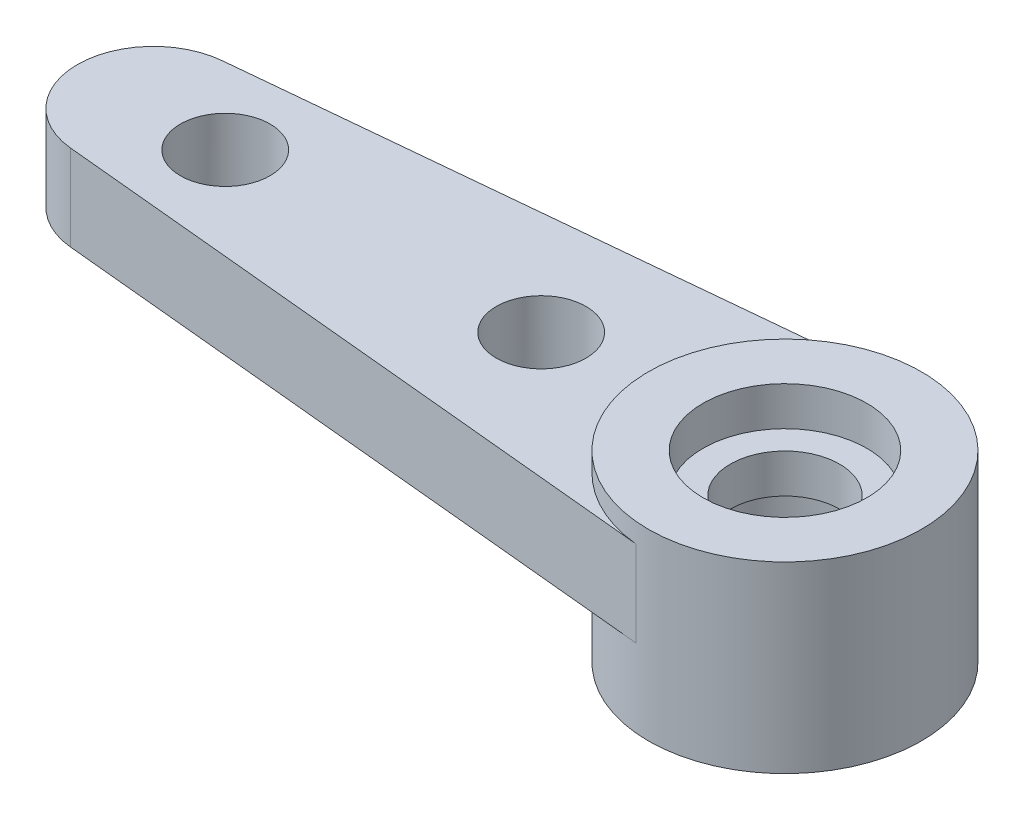
ISO-10303-21;
HEADER;
FILE_DESCRIPTION(('STEP AP214'),'2;1');
FILE_NAME('part.step','',(''),(''),'','','');
FILE_SCHEMA(('AUTOMOTIVE_DESIGN { 1 0 10303 214 1 1 1 1 }'));
ENDSEC;
DATA;
#1=APPLICATION_CONTEXT('core data for automotive mechanical design processes');
#2=APPLICATION_PROTOCOL_DEFINITION('international standard','automotive_design',2000,#1);
#3=PRODUCT_CONTEXT('',#1,'mechanical');
#4=PRODUCT('Part','Part','',(#3));
#5=PRODUCT_RELATED_PRODUCT_CATEGORY('part','',(#4));
#6=PRODUCT_DEFINITION_FORMATION('','',#4);
#7=PRODUCT_DEFINITION_CONTEXT('part definition',#1,'design');
#8=PRODUCT_DEFINITION('design','',#6,#7);
#9=PRODUCT_DEFINITION_SHAPE('','',#8);
#10=(LENGTH_UNIT() NAMED_UNIT(*) SI_UNIT(.MILLI.,.METRE.));
#11=(NAMED_UNIT(*) PLANE_ANGLE_UNIT() SI_UNIT($,.RADIAN.));
#12=(NAMED_UNIT(*) SI_UNIT($,.STERADIAN.) SOLID_ANGLE_UNIT());
#13=UNCERTAINTY_MEASURE_WITH_UNIT(LENGTH_MEASURE(1.E-05),#10,'distance_accuracy_value','');
#14=(GEOMETRIC_REPRESENTATION_CONTEXT(3) GLOBAL_UNCERTAINTY_ASSIGNED_CONTEXT((#13)) GLOBAL_UNIT_ASSIGNED_CONTEXT((#10,
#11,#12)) REPRESENTATION_CONTEXT('',''));
#15=CARTESIAN_POINT('',(0.,0.,0.));
#16=DIRECTION('',(0.,0.,1.));
#17=DIRECTION('',(1.,0.,0.));
#18=AXIS2_PLACEMENT_3D('',#15,#16,#17);
#19=CARTESIAN_POINT('',(0.,4.7,0.));
#20=DIRECTION('',(0.,-1.,0.));
#21=DIRECTION('',(0.,0.,-1.));
#22=AXIS2_PLACEMENT_3D('',#19,#20,#21);
#23=CYLINDRICAL_SURFACE('',#22,2.1);
#24=CARTESIAN_POINT('',(0.,0.,0.));
#25=DIRECTION('',(0.,1.,0.));
#26=DIRECTION('',(0.,0.,1.));
#27=AXIS2_PLACEMENT_3D('',#24,#25,#26);
#28=CIRCLE('',#27,2.1);
#29=CARTESIAN_POINT('',(0.,0.,2.1));
#30=VERTEX_POINT('',#29);
#31=EDGE_CURVE('E149',#30,#30,#28,.T.);
#32=ORIENTED_EDGE('',*,*,#31,.F.);
#33=EDGE_LOOP('',(#32));
#34=FACE_BOUND('',#33,.T.);
#35=CARTESIAN_POINT('',(0.,2.7,0.));
#36=DIRECTION('',(0.,1.,0.));
#37=DIRECTION('',(0.,0.,1.));
#38=AXIS2_PLACEMENT_3D('',#35,#36,#37);
#39=CIRCLE('',#38,2.1);
#40=CARTESIAN_POINT('',(0.,2.7,2.1));
#41=VERTEX_POINT('',#40);
#42=EDGE_CURVE('E142',#41,#41,#39,.T.);
#43=ORIENTED_EDGE('',*,*,#42,.T.);
#44=EDGE_LOOP('',(#43));
#45=FACE_BOUND('',#44,.T.);
#46=ADVANCED_FACE('F45',(#34,#45),#23,.F.);
#47=CARTESIAN_POINT('',(0.,4.7,0.));
#48=DIRECTION('',(0.,1.,0.));
#49=DIRECTION('',(0.,0.,1.));
#50=AXIS2_PLACEMENT_3D('',#47,#48,#49);
#51=PLANE('',#50);
#52=CARTESIAN_POINT('',(0.,4.7,0.));
#53=DIRECTION('',(0.,1.,0.));
#54=DIRECTION('',(0.,0.,1.));
#55=AXIS2_PLACEMENT_3D('',#52,#53,#54);
#56=CIRCLE('',#55,3.5);
#57=CARTESIAN_POINT('',(0.,4.7,3.5));
#58=VERTEX_POINT('',#57);
#59=EDGE_CURVE('E54',#58,#58,#56,.T.);
#60=ORIENTED_EDGE('',*,*,#59,.T.);
#61=EDGE_LOOP('',(#60));
#62=FACE_BOUND('',#61,.T.);
#63=CARTESIAN_POINT('',(0.,4.7,0.));
#64=DIRECTION('',(0.,1.,0.));
#65=DIRECTION('',(0.,0.,1.));
#66=AXIS2_PLACEMENT_3D('',#63,#64,#65);
#67=CIRCLE('',#66,2.1);
#68=CARTESIAN_POINT('',(0.,4.7,2.1));
#69=VERTEX_POINT('',#68);
#70=EDGE_CURVE('E150',#69,#69,#67,.T.);
#71=ORIENTED_EDGE('',*,*,#70,.F.);
#72=EDGE_LOOP('',(#71));
#73=FACE_BOUND('',#72,.T.);
#74=ADVANCED_FACE('F168',(#62,#73),#51,.T.);
#75=CARTESIAN_POINT('',(0.,0.,0.));
#76=DIRECTION('',(0.,1.,0.));
#77=DIRECTION('',(0.,0.,1.));
#78=AXIS2_PLACEMENT_3D('',#75,#76,#77);
#79=PLANE('',#78);
#80=CARTESIAN_POINT('',(0.,0.,0.));
#81=DIRECTION('',(0.,1.,0.));
#82=DIRECTION('',(0.,0.,1.));
#83=AXIS2_PLACEMENT_3D('',#80,#81,#82);
#84=CIRCLE('',#83,3.5);
#85=CARTESIAN_POINT('',(0.,0.,3.5));
#86=VERTEX_POINT('',#85);
#87=EDGE_CURVE('E154',#86,#86,#84,.T.);
#88=ORIENTED_EDGE('',*,*,#87,.F.);
#89=EDGE_LOOP('',(#88));
#90=FACE_BOUND('',#89,.T.);
#91=ORIENTED_EDGE('',*,*,#31,.T.);
#92=EDGE_LOOP('',(#91));
#93=FACE_BOUND('',#92,.T.);
#94=ADVANCED_FACE('F165',(#90,#93),#79,.F.);
#95=CARTESIAN_POINT('',(0.,4.7,0.));
#96=DIRECTION('',(0.,-1.,0.));
#97=DIRECTION('',(0.,0.,-1.));
#98=AXIS2_PLACEMENT_3D('',#95,#96,#97);
#99=CYLINDRICAL_SURFACE('',#98,3.5);
#100=DIRECTION('',(0.,1.,0.));
#101=VECTOR('',#100,1.);
#102=CARTESIAN_POINT('',(-0.335083384805435,2.,3.48392295052966));
#103=LINE('',#102,#101);
#104=CARTESIAN_POINT('',(-0.335083384805435,2.,3.48392295052967));
#105=VERTEX_POINT('',#104);
#106=CARTESIAN_POINT('',(-0.335083384805435,4.2,3.48392295052967));
#107=VERTEX_POINT('',#106);
#108=EDGE_CURVE('E61',#105,#107,#103,.T.);
#109=ORIENTED_EDGE('',*,*,#108,.F.);
#110=CARTESIAN_POINT('',(0.,2.,0.));
#111=DIRECTION('',(0.,-1.,0.));
#112=DIRECTION('',(0.,0.,-1.));
#113=AXIS2_PLACEMENT_3D('',#110,#111,#112);
#114=CIRCLE('',#113,3.5);
#115=CARTESIAN_POINT('',(-0.335083384805435,2.,-3.48392295052966));
#116=VERTEX_POINT('',#115);
#117=EDGE_CURVE('E65',#105,#116,#114,.T.);
#118=ORIENTED_EDGE('',*,*,#117,.T.);
#119=DIRECTION('',(0.,1.,0.));
#120=VECTOR('',#119,1.);
#121=CARTESIAN_POINT('',(-0.335083384805436,2.,-3.48392295052966));
#122=LINE('',#121,#120);
#123=CARTESIAN_POINT('',(-0.335083384805436,4.2,-3.48392295052966));
#124=VERTEX_POINT('',#123);
#125=EDGE_CURVE('E98',#116,#124,#122,.T.);
#126=ORIENTED_EDGE('',*,*,#125,.T.);
#127=CARTESIAN_POINT('',(0.,4.2,0.));
#128=DIRECTION('',(0.,-1.,0.));
#129=DIRECTION('',(0.,0.,-1.));
#130=AXIS2_PLACEMENT_3D('',#127,#128,#129);
#131=CIRCLE('',#130,3.5);
#132=EDGE_CURVE('E118',#107,#124,#131,.T.);
#133=ORIENTED_EDGE('',*,*,#132,.F.);
#134=EDGE_LOOP('',(#109,#118,#126,#133));
#135=FACE_BOUND('',#134,.T.);
#136=ORIENTED_EDGE('',*,*,#59,.F.);
#137=EDGE_LOOP('',(#136));
#138=FACE_BOUND('',#137,.T.);
#139=ORIENTED_EDGE('',*,*,#87,.T.);
#140=EDGE_LOOP('',(#139));
#141=FACE_BOUND('',#140,.T.);
#142=ADVANCED_FACE('F47',(#135,#138,#141),#99,.T.);
#143=CARTESIAN_POINT('',(0.,3.7,0.));
#144=DIRECTION('',(0.,1.,0.));
#145=DIRECTION('',(0.,0.,1.));
#146=AXIS2_PLACEMENT_3D('',#143,#144,#145);
#147=CIRCLE('',#146,2.1);
#148=CARTESIAN_POINT('',(0.,3.7,2.1));
#149=VERTEX_POINT('',#148);
#150=EDGE_CURVE('E11',#149,#149,#147,.T.);
#151=ORIENTED_EDGE('',*,*,#150,.F.);
#152=EDGE_LOOP('',(#151));
#153=FACE_BOUND('',#152,.T.);
#154=ORIENTED_EDGE('',*,*,#70,.T.);
#155=EDGE_LOOP('',(#154));
#156=FACE_BOUND('',#155,.T.);
#157=ADVANCED_FACE('F174',(#153,#156),#23,.F.);
#158=CARTESIAN_POINT('',(0.,2.7,0.));
#159=DIRECTION('',(0.,1.,0.));
#160=DIRECTION('',(0.,0.,1.));
#161=AXIS2_PLACEMENT_3D('',#158,#159,#160);
#162=PLANE('',#161);
#163=CARTESIAN_POINT('',(0.,2.7,0.));
#164=DIRECTION('',(0.,1.,0.));
#165=DIRECTION('',(0.,0.,1.));
#166=AXIS2_PLACEMENT_3D('',#163,#164,#165);
#167=CIRCLE('',#166,1.4);
#168=CARTESIAN_POINT('',(0.,2.7,1.4));
#169=VERTEX_POINT('',#168);
#170=EDGE_CURVE('E138',#169,#169,#167,.T.);
#171=ORIENTED_EDGE('',*,*,#170,.T.);
#172=EDGE_LOOP('',(#171));
#173=FACE_BOUND('',#172,.T.);
#174=ORIENTED_EDGE('',*,*,#42,.F.);
#175=EDGE_LOOP('',(#174));
#176=FACE_BOUND('',#175,.T.);
#177=ADVANCED_FACE('F177',(#173,#176),#162,.F.);
#178=CARTESIAN_POINT('',(0.,3.7,0.));
#179=DIRECTION('',(0.,1.,0.));
#180=DIRECTION('',(0.,0.,1.));
#181=AXIS2_PLACEMENT_3D('',#178,#179,#180);
#182=PLANE('',#181);
#183=CARTESIAN_POINT('',(0.,3.7,0.));
#184=DIRECTION('',(0.,1.,0.));
#185=DIRECTION('',(0.,0.,1.));
#186=AXIS2_PLACEMENT_3D('',#183,#184,#185);
#187=CIRCLE('',#186,1.4);
#188=CARTESIAN_POINT('',(0.,3.7,1.4));
#189=VERTEX_POINT('',#188);
#190=EDGE_CURVE('E133',#189,#189,#187,.T.);
#191=ORIENTED_EDGE('',*,*,#190,.F.);
#192=EDGE_LOOP('',(#191));
#193=FACE_BOUND('',#192,.T.);
#194=ORIENTED_EDGE('',*,*,#150,.T.);
#195=EDGE_LOOP('',(#194));
#196=FACE_BOUND('',#195,.T.);
#197=ADVANCED_FACE('F179',(#193,#196),#182,.T.);
#198=CARTESIAN_POINT('',(0.,2.7,0.));
#199=DIRECTION('',(0.,1.,0.));
#200=DIRECTION('',(0.,0.,1.));
#201=AXIS2_PLACEMENT_3D('',#198,#199,#200);
#202=CYLINDRICAL_SURFACE('',#201,1.4);
#203=ORIENTED_EDGE('',*,*,#170,.F.);
#204=EDGE_LOOP('',(#203));
#205=FACE_BOUND('',#204,.T.);
#206=ORIENTED_EDGE('',*,*,#190,.T.);
#207=EDGE_LOOP('',(#206));
#208=FACE_BOUND('',#207,.T.);
#209=ADVANCED_FACE('F186',(#205,#208),#202,.F.);
#210=CARTESIAN_POINT('',(-0.335083384805435,2.,3.48392295052966));
#211=DIRECTION('',(-0.0957381099444099,0.,0.99540655729419));
#212=DIRECTION('',(0.99540655729419,0.,0.0957381099444099));
#213=AXIS2_PLACEMENT_3D('',#210,#211,#212);
#214=PLANE('',#213);
#215=DIRECTION('',(0.99540655729419,0.,0.0957381099444099));
#216=VECTOR('',#215,1.);
#217=CARTESIAN_POINT('',(-0.335083384805435,4.2,3.48392295052966));
#218=LINE('',#217,#216);
#219=CARTESIAN_POINT('',(-16.3766893143916,4.2,1.94104278672367));
#220=VERTEX_POINT('',#219);
#221=EDGE_CURVE('E112',#220,#107,#218,.T.);
#222=ORIENTED_EDGE('',*,*,#221,.F.);
#223=DIRECTION('',(0.,1.,0.));
#224=VECTOR('',#223,1.);
#225=CARTESIAN_POINT('',(-16.3766893143916,2.,1.94104278672367));
#226=LINE('',#225,#224);
#227=CARTESIAN_POINT('',(-16.3766893143916,2.,1.94104278672367));
#228=VERTEX_POINT('',#227);
#229=EDGE_CURVE('E97',#228,#220,#226,.T.);
#230=ORIENTED_EDGE('',*,*,#229,.F.);
#231=DIRECTION('',(0.99540655729419,0.,0.0957381099444099));
#232=VECTOR('',#231,1.);
#233=CARTESIAN_POINT('',(-0.335083384805435,2.,3.48392295052966));
#234=LINE('',#233,#232);
#235=EDGE_CURVE('E105',#228,#105,#234,.T.);
#236=ORIENTED_EDGE('',*,*,#235,.T.);
#237=ORIENTED_EDGE('',*,*,#108,.T.);
#238=EDGE_LOOP('',(#222,#230,#236,#237));
#239=FACE_BOUND('',#238,.T.);
#240=ADVANCED_FACE('F214',(#239),#214,.T.);
#241=CARTESIAN_POINT('',(-16.19,2.,0.));
#242=DIRECTION('',(0.,1.,0.));
#243=DIRECTION('',(0.,0.,1.));
#244=AXIS2_PLACEMENT_3D('',#241,#242,#243);
#245=CYLINDRICAL_SURFACE('',#244,1.95);
#246=CARTESIAN_POINT('',(-16.19,4.2,0.));
#247=DIRECTION('',(0.,1.,0.));
#248=DIRECTION('',(0.,0.,-1.));
#249=AXIS2_PLACEMENT_3D('',#246,#247,#248);
#250=CIRCLE('',#249,1.95);
#251=CARTESIAN_POINT('',(-16.3766893143916,4.2,-1.94104278672367));
#252=VERTEX_POINT('',#251);
#253=EDGE_CURVE('E91',#252,#220,#250,.T.);
#254=ORIENTED_EDGE('',*,*,#253,.F.);
#255=DIRECTION('',(0.,1.,0.));
#256=VECTOR('',#255,1.);
#257=CARTESIAN_POINT('',(-16.3766893143916,2.,-1.94104278672367));
#258=LINE('',#257,#256);
#259=CARTESIAN_POINT('',(-16.3766893143916,2.,-1.94104278672367));
#260=VERTEX_POINT('',#259);
#261=EDGE_CURVE('E85',#260,#252,#258,.T.);
#262=ORIENTED_EDGE('',*,*,#261,.F.);
#263=CARTESIAN_POINT('',(-16.19,2.,0.));
#264=DIRECTION('',(0.,1.,0.));
#265=DIRECTION('',(0.,0.,-1.));
#266=AXIS2_PLACEMENT_3D('',#263,#264,#265);
#267=CIRCLE('',#266,1.95);
#268=EDGE_CURVE('E88',#260,#228,#267,.T.);
#269=ORIENTED_EDGE('',*,*,#268,.T.);
#270=ORIENTED_EDGE('',*,*,#229,.T.);
#271=EDGE_LOOP('',(#254,#262,#269,#270));
#272=FACE_BOUND('',#271,.T.);
#273=ADVANCED_FACE('F87',(#272),#245,.T.);
#274=CARTESIAN_POINT('',(-0.335083384805436,2.,-3.48392295052966));
#275=DIRECTION('',(-0.0957381099444101,0.,-0.99540655729419));
#276=DIRECTION('',(-0.99540655729419,0.,0.0957381099444101));
#277=AXIS2_PLACEMENT_3D('',#274,#275,#276);
#278=PLANE('',#277);
#279=DIRECTION('',(-0.99540655729419,0.,0.0957381099444101));
#280=VECTOR('',#279,1.);
#281=CARTESIAN_POINT('',(-0.335083384805436,4.2,-3.48392295052966));
#282=LINE('',#281,#280);
#283=EDGE_CURVE('E122',#124,#252,#282,.T.);
#284=ORIENTED_EDGE('',*,*,#283,.F.);
#285=ORIENTED_EDGE('',*,*,#125,.F.);
#286=DIRECTION('',(-0.99540655729419,0.,0.0957381099444101));
#287=VECTOR('',#286,1.);
#288=CARTESIAN_POINT('',(-0.335083384805436,2.,-3.48392295052966));
#289=LINE('',#288,#287);
#290=EDGE_CURVE('E103',#116,#260,#289,.T.);
#291=ORIENTED_EDGE('',*,*,#290,.T.);
#292=ORIENTED_EDGE('',*,*,#261,.T.);
#293=EDGE_LOOP('',(#284,#285,#291,#292));
#294=FACE_BOUND('',#293,.T.);
#295=ADVANCED_FACE('F108',(#294),#278,.T.);
#296=CARTESIAN_POINT('',(0.,2.,0.));
#297=DIRECTION('',(0.,-1.,0.));
#298=DIRECTION('',(0.,0.,-1.));
#299=AXIS2_PLACEMENT_3D('',#296,#297,#298);
#300=PLANE('',#299);
#301=CARTESIAN_POINT('',(-14.35,2.,0.));
#302=DIRECTION('',(0.,-1.,0.));
#303=DIRECTION('',(0.,0.,-1.));
#304=AXIS2_PLACEMENT_3D('',#301,#302,#303);
#305=CIRCLE('',#304,1.15);
#306=CARTESIAN_POINT('',(-14.35,2.,-1.15));
#307=VERTEX_POINT('',#306);
#308=EDGE_CURVE('E321',#307,#307,#305,.F.);
#309=ORIENTED_EDGE('',*,*,#308,.T.);
#310=EDGE_LOOP('',(#309));
#311=FACE_BOUND('',#310,.T.);
#312=CARTESIAN_POINT('',(-6.25,2.,0.));
#313=DIRECTION('',(0.,-1.,0.));
#314=DIRECTION('',(0.,0.,-1.));
#315=AXIS2_PLACEMENT_3D('',#312,#313,#314);
#316=CIRCLE('',#315,1.15);
#317=CARTESIAN_POINT('',(-6.25,2.,-1.15));
#318=VERTEX_POINT('',#317);
#319=EDGE_CURVE('E327',#318,#318,#316,.F.);
#320=ORIENTED_EDGE('',*,*,#319,.T.);
#321=EDGE_LOOP('',(#320));
#322=FACE_BOUND('',#321,.T.);
#323=ORIENTED_EDGE('',*,*,#117,.F.);
#324=ORIENTED_EDGE('',*,*,#235,.F.);
#325=ORIENTED_EDGE('',*,*,#268,.F.);
#326=ORIENTED_EDGE('',*,*,#290,.F.);
#327=EDGE_LOOP('',(#323,#324,#325,#326));
#328=FACE_BOUND('',#327,.T.);
#329=ADVANCED_FACE('F102',(#311,#322,#328),#300,.T.);
#330=CARTESIAN_POINT('',(0.,4.2,0.));
#331=DIRECTION('',(0.,-1.,0.));
#332=DIRECTION('',(0.,0.,-1.));
#333=AXIS2_PLACEMENT_3D('',#330,#331,#332);
#334=PLANE('',#333);
#335=CARTESIAN_POINT('',(-14.35,4.2,0.));
#336=DIRECTION('',(0.,1.,0.));
#337=DIRECTION('',(0.,0.,1.));
#338=AXIS2_PLACEMENT_3D('',#335,#336,#337);
#339=CIRCLE('',#338,1.15);
#340=CARTESIAN_POINT('',(-14.35,4.2,1.15));
#341=VERTEX_POINT('',#340);
#342=EDGE_CURVE('E123',#341,#341,#339,.T.);
#343=ORIENTED_EDGE('',*,*,#342,.F.);
#344=EDGE_LOOP('',(#343));
#345=FACE_BOUND('',#344,.T.);
#346=CARTESIAN_POINT('',(-6.25,4.2,0.));
#347=DIRECTION('',(0.,1.,0.));
#348=DIRECTION('',(0.,0.,1.));
#349=AXIS2_PLACEMENT_3D('',#346,#347,#348);
#350=CIRCLE('',#349,1.15);
#351=CARTESIAN_POINT('',(-6.25,4.2,1.15));
#352=VERTEX_POINT('',#351);
#353=EDGE_CURVE('E332',#352,#352,#350,.T.);
#354=ORIENTED_EDGE('',*,*,#353,.F.);
#355=EDGE_LOOP('',(#354));
#356=FACE_BOUND('',#355,.T.);
#357=ORIENTED_EDGE('',*,*,#132,.T.);
#358=ORIENTED_EDGE('',*,*,#283,.T.);
#359=ORIENTED_EDGE('',*,*,#253,.T.);
#360=ORIENTED_EDGE('',*,*,#221,.T.);
#361=EDGE_LOOP('',(#357,#358,#359,#360));
#362=FACE_BOUND('',#361,.T.);
#363=ADVANCED_FACE('F239',(#345,#356,#362),#334,.F.);
#364=CARTESIAN_POINT('',(-6.25,-0.00100000000000013,0.));
#365=DIRECTION('',(0.,1.,0.));
#366=DIRECTION('',(0.,0.,1.));
#367=AXIS2_PLACEMENT_3D('',#364,#365,#366);
#368=CYLINDRICAL_SURFACE('',#367,1.15);
#369=ORIENTED_EDGE('',*,*,#319,.F.);
#370=EDGE_LOOP('',(#369));
#371=FACE_BOUND('',#370,.T.);
#372=ORIENTED_EDGE('',*,*,#353,.T.);
#373=EDGE_LOOP('',(#372));
#374=FACE_BOUND('',#373,.T.);
#375=ADVANCED_FACE('F248',(#371,#374),#368,.F.);
#376=CARTESIAN_POINT('',(-14.35,-0.00100000000000013,0.));
#377=DIRECTION('',(0.,1.,0.));
#378=DIRECTION('',(0.,0.,1.));
#379=AXIS2_PLACEMENT_3D('',#376,#377,#378);
#380=CYLINDRICAL_SURFACE('',#379,1.15);
#381=ORIENTED_EDGE('',*,*,#308,.F.);
#382=EDGE_LOOP('',(#381));
#383=FACE_BOUND('',#382,.T.);
#384=ORIENTED_EDGE('',*,*,#342,.T.);
#385=EDGE_LOOP('',(#384));
#386=FACE_BOUND('',#385,.T.);
#387=ADVANCED_FACE('F257',(#383,#386),#380,.F.);
#388=CLOSED_SHELL('',(#46,#74,#94,#142,#157,#177,#197,#209,#240,#273,#295,#329,#363,#375,#387));
#389=MANIFOLD_SOLID_BREP('B2',#388);
#390=ADVANCED_BREP_SHAPE_REPRESENTATION('',(#18,#389),#14);
#391=SHAPE_DEFINITION_REPRESENTATION(#9,#390);
ENDSEC;
END-ISO-10303-21;
